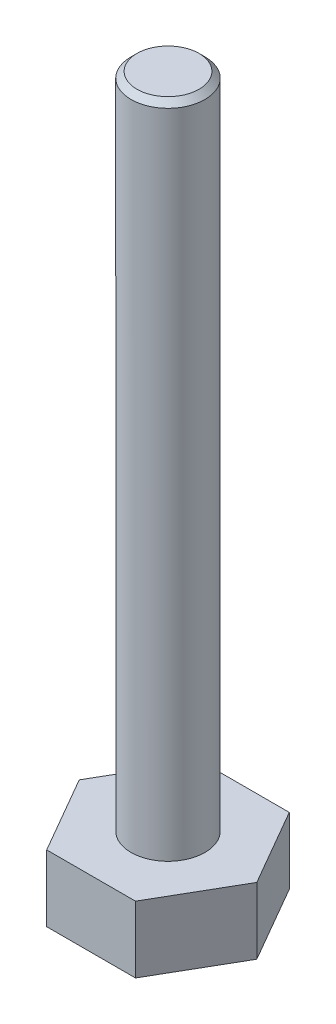
ISO-10303-21;
HEADER;
FILE_DESCRIPTION(('STEP AP214'),'2;1');
FILE_NAME('part.step','',(''),(''),'','','');
FILE_SCHEMA(('AUTOMOTIVE_DESIGN { 1 0 10303 214 1 1 1 1 }'));
ENDSEC;
DATA;
#1=APPLICATION_CONTEXT('core data for automotive mechanical design processes');
#2=APPLICATION_PROTOCOL_DEFINITION('international standard','automotive_design',2000,#1);
#3=PRODUCT_CONTEXT('',#1,'mechanical');
#4=PRODUCT('Part','Part','',(#3));
#5=PRODUCT_RELATED_PRODUCT_CATEGORY('part','',(#4));
#6=PRODUCT_DEFINITION_FORMATION('','',#4);
#7=PRODUCT_DEFINITION_CONTEXT('part definition',#1,'design');
#8=PRODUCT_DEFINITION('design','',#6,#7);
#9=PRODUCT_DEFINITION_SHAPE('','',#8);
#10=(LENGTH_UNIT() NAMED_UNIT(*) SI_UNIT(.MILLI.,.METRE.));
#11=(NAMED_UNIT(*) PLANE_ANGLE_UNIT() SI_UNIT($,.RADIAN.));
#12=(NAMED_UNIT(*) SI_UNIT($,.STERADIAN.) SOLID_ANGLE_UNIT());
#13=UNCERTAINTY_MEASURE_WITH_UNIT(LENGTH_MEASURE(1.E-05),#10,'distance_accuracy_value','');
#14=(GEOMETRIC_REPRESENTATION_CONTEXT(3) GLOBAL_UNCERTAINTY_ASSIGNED_CONTEXT((#13)) GLOBAL_UNIT_ASSIGNED_CONTEXT((#10,
#11,#12)) REPRESENTATION_CONTEXT('',''));
#15=CARTESIAN_POINT('',(0.,0.,0.));
#16=DIRECTION('',(0.,0.,1.));
#17=DIRECTION('',(1.,0.,0.));
#18=AXIS2_PLACEMENT_3D('',#15,#16,#17);
#19=CARTESIAN_POINT('',(0.,45.,0.));
#20=DIRECTION('',(0.,1.,0.));
#21=DIRECTION('',(0.,0.,1.));
#22=AXIS2_PLACEMENT_3D('',#19,#20,#21);
#23=PLANE('',#22);
#24=DIRECTION('',(1.,0.,0.));
#25=VECTOR('',#24,1.);
#26=CARTESIAN_POINT('',(-30.0222139978605,45.,52.));
#27=LINE('',#26,#25);
#28=CARTESIAN_POINT('',(-30.0222139978605,45.,52.));
#29=VERTEX_POINT('',#28);
#30=CARTESIAN_POINT('',(30.0222139978606,45.,52.));
#31=VERTEX_POINT('',#30);
#32=EDGE_CURVE('E137',#29,#31,#27,.T.);
#33=ORIENTED_EDGE('',*,*,#32,.T.);
#34=DIRECTION('',(0.5,0.,-0.866025403784439));
#35=VECTOR('',#34,1.);
#36=CARTESIAN_POINT('',(30.0222139978606,45.,52.));
#37=LINE('',#36,#35);
#38=CARTESIAN_POINT('',(60.0444279957211,45.,0.));
#39=VERTEX_POINT('',#38);
#40=EDGE_CURVE('E95',#31,#39,#37,.T.);
#41=ORIENTED_EDGE('',*,*,#40,.T.);
#42=DIRECTION('',(-0.5,0.,-0.866025403784439));
#43=VECTOR('',#42,1.);
#44=CARTESIAN_POINT('',(60.0444279957211,45.,0.));
#45=LINE('',#44,#43);
#46=CARTESIAN_POINT('',(30.0222139978605,45.,-52.));
#47=VERTEX_POINT('',#46);
#48=EDGE_CURVE('E108',#39,#47,#45,.T.);
#49=ORIENTED_EDGE('',*,*,#48,.T.);
#50=DIRECTION('',(-1.,0.,0.));
#51=VECTOR('',#50,1.);
#52=CARTESIAN_POINT('',(30.0222139978605,45.,-52.));
#53=LINE('',#52,#51);
#54=CARTESIAN_POINT('',(-30.0222139978605,45.,-52.));
#55=VERTEX_POINT('',#54);
#56=EDGE_CURVE('E102',#47,#55,#53,.T.);
#57=ORIENTED_EDGE('',*,*,#56,.T.);
#58=DIRECTION('',(-0.5,0.,0.866025403784439));
#59=VECTOR('',#58,1.);
#60=CARTESIAN_POINT('',(-30.0222139978605,45.,-52.));
#61=LINE('',#60,#59);
#62=CARTESIAN_POINT('',(-60.0444279957211,45.,0.));
#63=VERTEX_POINT('',#62);
#64=EDGE_CURVE('E106',#55,#63,#61,.T.);
#65=ORIENTED_EDGE('',*,*,#64,.T.);
#66=DIRECTION('',(0.5,0.,0.866025403784439));
#67=VECTOR('',#66,1.);
#68=CARTESIAN_POINT('',(-60.0444279957211,45.,0.));
#69=LINE('',#68,#67);
#70=EDGE_CURVE('E57',#63,#29,#69,.T.);
#71=ORIENTED_EDGE('',*,*,#70,.T.);
#72=EDGE_LOOP('',(#33,#41,#49,#57,#65,#71));
#73=FACE_BOUND('',#72,.T.);
#74=CARTESIAN_POINT('',(0.,45.,0.));
#75=DIRECTION('',(0.,1.,0.));
#76=DIRECTION('',(0.,0.,1.));
#77=AXIS2_PLACEMENT_3D('',#74,#75,#76);
#78=CIRCLE('',#77,25.);
#79=CARTESIAN_POINT('',(0.,45.,25.));
#80=VERTEX_POINT('',#79);
#81=EDGE_CURVE('E130',#80,#80,#78,.T.);
#82=ORIENTED_EDGE('',*,*,#81,.F.);
#83=EDGE_LOOP('',(#82));
#84=FACE_BOUND('',#83,.T.);
#85=ADVANCED_FACE('F39',(#73,#84),#23,.T.);
#86=CARTESIAN_POINT('',(0.,0.,0.));
#87=DIRECTION('',(0.,1.,0.));
#88=DIRECTION('',(0.,0.,1.));
#89=AXIS2_PLACEMENT_3D('',#86,#87,#88);
#90=PLANE('',#89);
#91=DIRECTION('',(1.,0.,0.));
#92=VECTOR('',#91,1.);
#93=CARTESIAN_POINT('',(-30.0222139978605,0.,52.));
#94=LINE('',#93,#92);
#95=CARTESIAN_POINT('',(-30.0222139978605,0.,52.));
#96=VERTEX_POINT('',#95);
#97=CARTESIAN_POINT('',(30.0222139978606,0.,52.));
#98=VERTEX_POINT('',#97);
#99=EDGE_CURVE('E126',#96,#98,#94,.T.);
#100=ORIENTED_EDGE('',*,*,#99,.F.);
#101=DIRECTION('',(0.5,0.,0.866025403784439));
#102=VECTOR('',#101,1.);
#103=CARTESIAN_POINT('',(-60.0444279957211,0.,0.));
#104=LINE('',#103,#102);
#105=CARTESIAN_POINT('',(-60.0444279957211,0.,0.));
#106=VERTEX_POINT('',#105);
#107=EDGE_CURVE('E86',#106,#96,#104,.T.);
#108=ORIENTED_EDGE('',*,*,#107,.F.);
#109=DIRECTION('',(-0.5,0.,0.866025403784439));
#110=VECTOR('',#109,1.);
#111=CARTESIAN_POINT('',(-30.0222139978605,0.,-52.));
#112=LINE('',#111,#110);
#113=CARTESIAN_POINT('',(-30.0222139978605,0.,-52.));
#114=VERTEX_POINT('',#113);
#115=EDGE_CURVE('E80',#114,#106,#112,.T.);
#116=ORIENTED_EDGE('',*,*,#115,.F.);
#117=DIRECTION('',(-1.,0.,0.));
#118=VECTOR('',#117,1.);
#119=CARTESIAN_POINT('',(30.0222139978605,0.,-52.));
#120=LINE('',#119,#118);
#121=CARTESIAN_POINT('',(30.0222139978605,0.,-52.));
#122=VERTEX_POINT('',#121);
#123=EDGE_CURVE('E116',#122,#114,#120,.T.);
#124=ORIENTED_EDGE('',*,*,#123,.F.);
#125=DIRECTION('',(-0.5,0.,-0.866025403784439));
#126=VECTOR('',#125,1.);
#127=CARTESIAN_POINT('',(60.0444279957211,0.,0.));
#128=LINE('',#127,#126);
#129=CARTESIAN_POINT('',(60.0444279957211,0.,0.));
#130=VERTEX_POINT('',#129);
#131=EDGE_CURVE('E132',#130,#122,#128,.T.);
#132=ORIENTED_EDGE('',*,*,#131,.F.);
#133=DIRECTION('',(0.5,0.,-0.866025403784439));
#134=VECTOR('',#133,1.);
#135=CARTESIAN_POINT('',(30.0222139978606,0.,52.));
#136=LINE('',#135,#134);
#137=EDGE_CURVE('E129',#98,#130,#136,.T.);
#138=ORIENTED_EDGE('',*,*,#137,.F.);
#139=EDGE_LOOP('',(#100,#108,#116,#124,#132,#138));
#140=FACE_BOUND('',#139,.T.);
#141=ADVANCED_FACE('F161',(#140),#90,.F.);
#142=CARTESIAN_POINT('',(-30.0222139978605,45.,52.));
#143=DIRECTION('',(0.,0.,-1.));
#144=DIRECTION('',(-1.,0.,0.));
#145=AXIS2_PLACEMENT_3D('',#142,#143,#144);
#146=PLANE('',#145);
#147=ORIENTED_EDGE('',*,*,#99,.T.);
#148=DIRECTION('',(0.,-1.,0.));
#149=VECTOR('',#148,1.);
#150=CARTESIAN_POINT('',(30.0222139978606,45.,52.));
#151=LINE('',#150,#149);
#152=EDGE_CURVE('E144',#31,#98,#151,.T.);
#153=ORIENTED_EDGE('',*,*,#152,.F.);
#154=ORIENTED_EDGE('',*,*,#32,.F.);
#155=DIRECTION('',(0.,-1.,0.));
#156=VECTOR('',#155,1.);
#157=CARTESIAN_POINT('',(-30.0222139978605,45.,52.));
#158=LINE('',#157,#156);
#159=EDGE_CURVE('E122',#29,#96,#158,.T.);
#160=ORIENTED_EDGE('',*,*,#159,.T.);
#161=EDGE_LOOP('',(#147,#153,#154,#160));
#162=FACE_BOUND('',#161,.T.);
#163=ADVANCED_FACE('F166',(#162),#146,.F.);
#164=CARTESIAN_POINT('',(30.0222139978606,45.,52.));
#165=DIRECTION('',(-0.866025403784439,0.,-0.5));
#166=DIRECTION('',(-0.5,0.,0.866025403784439));
#167=AXIS2_PLACEMENT_3D('',#164,#165,#166);
#168=PLANE('',#167);
#169=ORIENTED_EDGE('',*,*,#137,.T.);
#170=DIRECTION('',(0.,-1.,0.));
#171=VECTOR('',#170,1.);
#172=CARTESIAN_POINT('',(60.0444279957211,45.,0.));
#173=LINE('',#172,#171);
#174=EDGE_CURVE('E141',#39,#130,#173,.T.);
#175=ORIENTED_EDGE('',*,*,#174,.F.);
#176=ORIENTED_EDGE('',*,*,#40,.F.);
#177=ORIENTED_EDGE('',*,*,#152,.T.);
#178=EDGE_LOOP('',(#169,#175,#176,#177));
#179=FACE_BOUND('',#178,.T.);
#180=ADVANCED_FACE('F181',(#179),#168,.F.);
#181=CARTESIAN_POINT('',(60.0444279957211,45.,0.));
#182=DIRECTION('',(-0.866025403784438,0.,0.5));
#183=DIRECTION('',(0.5,0.,0.866025403784439));
#184=AXIS2_PLACEMENT_3D('',#181,#182,#183);
#185=PLANE('',#184);
#186=ORIENTED_EDGE('',*,*,#131,.T.);
#187=DIRECTION('',(0.,-1.,0.));
#188=VECTOR('',#187,1.);
#189=CARTESIAN_POINT('',(30.0222139978605,45.,-52.));
#190=LINE('',#189,#188);
#191=EDGE_CURVE('E117',#47,#122,#190,.T.);
#192=ORIENTED_EDGE('',*,*,#191,.F.);
#193=ORIENTED_EDGE('',*,*,#48,.F.);
#194=ORIENTED_EDGE('',*,*,#174,.T.);
#195=EDGE_LOOP('',(#186,#192,#193,#194));
#196=FACE_BOUND('',#195,.T.);
#197=ADVANCED_FACE('F178',(#196),#185,.F.);
#198=CARTESIAN_POINT('',(30.0222139978605,45.,-52.));
#199=DIRECTION('',(0.,0.,1.));
#200=DIRECTION('',(1.,0.,0.));
#201=AXIS2_PLACEMENT_3D('',#198,#199,#200);
#202=PLANE('',#201);
#203=ORIENTED_EDGE('',*,*,#123,.T.);
#204=DIRECTION('',(0.,-1.,0.));
#205=VECTOR('',#204,1.);
#206=CARTESIAN_POINT('',(-30.0222139978605,45.,-52.));
#207=LINE('',#206,#205);
#208=EDGE_CURVE('E113',#55,#114,#207,.T.);
#209=ORIENTED_EDGE('',*,*,#208,.F.);
#210=ORIENTED_EDGE('',*,*,#56,.F.);
#211=ORIENTED_EDGE('',*,*,#191,.T.);
#212=EDGE_LOOP('',(#203,#209,#210,#211));
#213=FACE_BOUND('',#212,.T.);
#214=ADVANCED_FACE('F114',(#213),#202,.F.);
#215=CARTESIAN_POINT('',(-30.0222139978605,45.,-52.));
#216=DIRECTION('',(0.866025403784439,0.,0.5));
#217=DIRECTION('',(0.5,0.,-0.866025403784439));
#218=AXIS2_PLACEMENT_3D('',#215,#216,#217);
#219=PLANE('',#218);
#220=ORIENTED_EDGE('',*,*,#115,.T.);
#221=DIRECTION('',(0.,-1.,0.));
#222=VECTOR('',#221,1.);
#223=CARTESIAN_POINT('',(-60.0444279957211,45.,0.));
#224=LINE('',#223,#222);
#225=EDGE_CURVE('E118',#63,#106,#224,.T.);
#226=ORIENTED_EDGE('',*,*,#225,.F.);
#227=ORIENTED_EDGE('',*,*,#64,.F.);
#228=ORIENTED_EDGE('',*,*,#208,.T.);
#229=EDGE_LOOP('',(#220,#226,#227,#228));
#230=FACE_BOUND('',#229,.T.);
#231=ADVANCED_FACE('F120',(#230),#219,.F.);
#232=CARTESIAN_POINT('',(-60.0444279957211,45.,0.));
#233=DIRECTION('',(0.866025403784438,0.,-0.5));
#234=DIRECTION('',(-0.5,0.,-0.866025403784439));
#235=AXIS2_PLACEMENT_3D('',#232,#233,#234);
#236=PLANE('',#235);
#237=ORIENTED_EDGE('',*,*,#107,.T.);
#238=ORIENTED_EDGE('',*,*,#159,.F.);
#239=ORIENTED_EDGE('',*,*,#70,.F.);
#240=ORIENTED_EDGE('',*,*,#225,.T.);
#241=EDGE_LOOP('',(#237,#238,#239,#240));
#242=FACE_BOUND('',#241,.T.);
#243=ADVANCED_FACE('F171',(#242),#236,.F.);
#244=CARTESIAN_POINT('',(0.,490.,0.));
#245=DIRECTION('',(0.,-1.,0.));
#246=DIRECTION('',(0.,0.,-1.));
#247=AXIS2_PLACEMENT_3D('',#244,#245,#246);
#248=CYLINDRICAL_SURFACE('',#247,25.);
#249=CARTESIAN_POINT('',(0.,486.,0.));
#250=DIRECTION('',(0.,-1.,0.));
#251=DIRECTION('',(0.,0.,-1.));
#252=AXIS2_PLACEMENT_3D('',#249,#250,#251);
#253=CIRCLE('',#252,25.);
#254=CARTESIAN_POINT('',(0.,486.,-25.));
#255=VERTEX_POINT('',#254);
#256=EDGE_CURVE('E49',#255,#255,#253,.T.);
#257=ORIENTED_EDGE('',*,*,#256,.T.);
#258=EDGE_LOOP('',(#257));
#259=FACE_BOUND('',#258,.T.);
#260=ORIENTED_EDGE('',*,*,#81,.T.);
#261=EDGE_LOOP('',(#260));
#262=FACE_BOUND('',#261,.T.);
#263=ADVANCED_FACE('F148',(#259,#262),#248,.T.);
#264=CARTESIAN_POINT('',(0.,490.,0.));
#265=DIRECTION('',(0.,-1.,0.));
#266=DIRECTION('',(0.,0.,-1.));
#267=AXIS2_PLACEMENT_3D('',#264,#265,#266);
#268=PLANE('',#267);
#269=CARTESIAN_POINT('',(0.,490.,0.));
#270=DIRECTION('',(0.,-1.,0.));
#271=DIRECTION('',(0.,0.,-1.));
#272=AXIS2_PLACEMENT_3D('',#269,#270,#271);
#273=CIRCLE('',#272,21.0000000000001);
#274=CARTESIAN_POINT('',(0.,490.,-21.0000000000001));
#275=VERTEX_POINT('',#274);
#276=EDGE_CURVE('E11',#275,#275,#273,.F.);
#277=ORIENTED_EDGE('',*,*,#276,.T.);
#278=EDGE_LOOP('',(#277));
#279=FACE_BOUND('',#278,.T.);
#280=ADVANCED_FACE('F152',(#279),#268,.F.);
#281=CARTESIAN_POINT('',(0.,486.,0.));
#282=DIRECTION('',(0.,-1.,0.));
#283=DIRECTION('',(0.,0.,-1.));
#284=AXIS2_PLACEMENT_3D('',#281,#282,#283);
#285=CONICAL_SURFACE('',#284,25.,0.785398163397439);
#286=ORIENTED_EDGE('',*,*,#276,.F.);
#287=EDGE_LOOP('',(#286));
#288=FACE_BOUND('',#287,.T.);
#289=ORIENTED_EDGE('',*,*,#256,.F.);
#290=EDGE_LOOP('',(#289));
#291=FACE_BOUND('',#290,.T.);
#292=ADVANCED_FACE('F42',(#288,#291),#285,.T.);
#293=CLOSED_SHELL('',(#85,#141,#163,#180,#197,#214,#231,#243,#263,#280,#292));
#294=MANIFOLD_SOLID_BREP('B2',#293);
#295=ADVANCED_BREP_SHAPE_REPRESENTATION('',(#18,#294),#14);
#296=SHAPE_DEFINITION_REPRESENTATION(#9,#295);
ENDSEC;
END-ISO-10303-21;
